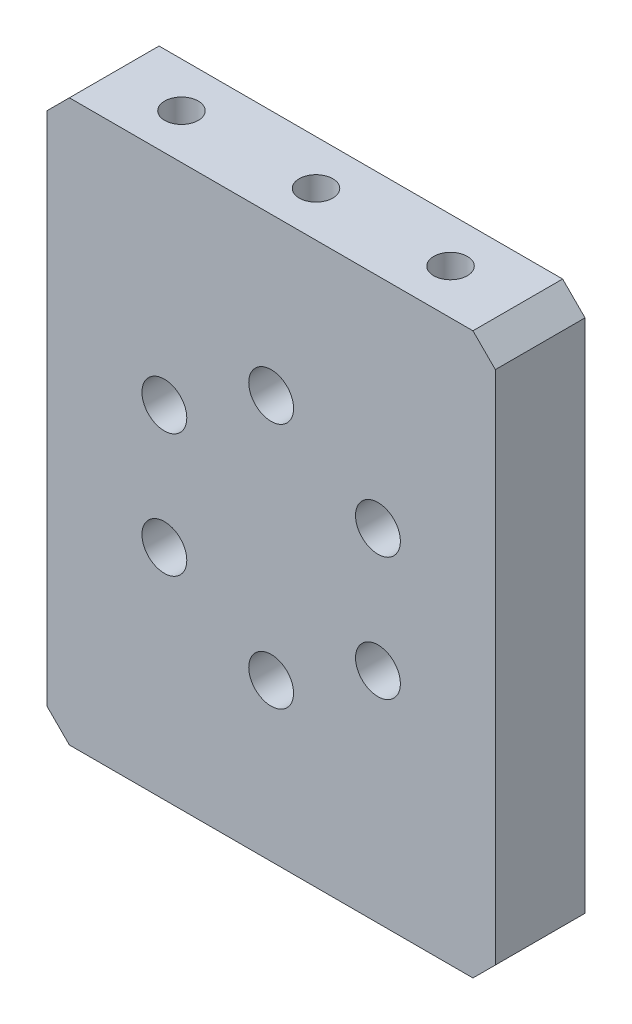
ISO-10303-21;
HEADER;
FILE_DESCRIPTION(('STEP AP214'),'2;1');
FILE_NAME('part.step','',(''),(''),'','','');
FILE_SCHEMA(('AUTOMOTIVE_DESIGN { 1 0 10303 214 1 1 1 1 }'));
ENDSEC;
DATA;
#1=APPLICATION_CONTEXT('core data for automotive mechanical design processes');
#2=APPLICATION_PROTOCOL_DEFINITION('international standard','automotive_design',2000,#1);
#3=PRODUCT_CONTEXT('',#1,'mechanical');
#4=PRODUCT('Part','Part','',(#3));
#5=PRODUCT_RELATED_PRODUCT_CATEGORY('part','',(#4));
#6=PRODUCT_DEFINITION_FORMATION('','',#4);
#7=PRODUCT_DEFINITION_CONTEXT('part definition',#1,'design');
#8=PRODUCT_DEFINITION('design','',#6,#7);
#9=PRODUCT_DEFINITION_SHAPE('','',#8);
#10=(LENGTH_UNIT() NAMED_UNIT(*) SI_UNIT(.MILLI.,.METRE.));
#11=(NAMED_UNIT(*) PLANE_ANGLE_UNIT() SI_UNIT($,.RADIAN.));
#12=(NAMED_UNIT(*) SI_UNIT($,.STERADIAN.) SOLID_ANGLE_UNIT());
#13=UNCERTAINTY_MEASURE_WITH_UNIT(LENGTH_MEASURE(1.E-05),#10,'distance_accuracy_value','');
#14=(GEOMETRIC_REPRESENTATION_CONTEXT(3) GLOBAL_UNCERTAINTY_ASSIGNED_CONTEXT((#13)) GLOBAL_UNIT_ASSIGNED_CONTEXT((#10,
#11,#12)) REPRESENTATION_CONTEXT('',''));
#15=CARTESIAN_POINT('',(0.,0.,0.));
#16=DIRECTION('',(0.,0.,1.));
#17=DIRECTION('',(1.,0.,0.));
#18=AXIS2_PLACEMENT_3D('',#15,#16,#17);
#19=CARTESIAN_POINT('',(20.,25.,8.));
#20=DIRECTION('',(-1.,0.,0.));
#21=DIRECTION('',(0.,-1.,0.));
#22=AXIS2_PLACEMENT_3D('',#19,#20,#21);
#23=PLANE('',#22);
#24=DIRECTION('',(0.,1.,0.));
#25=VECTOR('',#24,1.);
#26=CARTESIAN_POINT('',(20.,25.,8.));
#27=LINE('',#26,#25);
#28=CARTESIAN_POINT('',(20.,-23.,8.));
#29=VERTEX_POINT('',#28);
#30=CARTESIAN_POINT('',(20.,23.,8.));
#31=VERTEX_POINT('',#30);
#32=EDGE_CURVE('E135',#29,#31,#27,.T.);
#33=ORIENTED_EDGE('',*,*,#32,.F.);
#34=DIRECTION('',(0.,0.,-1.));
#35=VECTOR('',#34,1.);
#36=CARTESIAN_POINT('',(20.,-23.,8.));
#37=LINE('',#36,#35);
#38=CARTESIAN_POINT('',(20.,-23.,0.));
#39=VERTEX_POINT('',#38);
#40=EDGE_CURVE('E161',#29,#39,#37,.T.);
#41=ORIENTED_EDGE('',*,*,#40,.T.);
#42=DIRECTION('',(0.,1.,0.));
#43=VECTOR('',#42,1.);
#44=CARTESIAN_POINT('',(20.,25.,0.));
#45=LINE('',#44,#43);
#46=CARTESIAN_POINT('',(20.,23.,0.));
#47=VERTEX_POINT('',#46);
#48=EDGE_CURVE('E232',#39,#47,#45,.T.);
#49=ORIENTED_EDGE('',*,*,#48,.T.);
#50=DIRECTION('',(0.,0.,1.));
#51=VECTOR('',#50,1.);
#52=CARTESIAN_POINT('',(20.,23.,8.));
#53=LINE('',#52,#51);
#54=EDGE_CURVE('E159',#47,#31,#53,.T.);
#55=ORIENTED_EDGE('',*,*,#54,.T.);
#56=EDGE_LOOP('',(#33,#41,#49,#55));
#57=FACE_BOUND('',#56,.T.);
#58=ADVANCED_FACE('F41',(#57),#23,.F.);
#59=CARTESIAN_POINT('',(-20.,25.,8.));
#60=DIRECTION('',(0.,-1.,0.));
#61=DIRECTION('',(0.,0.,-1.));
#62=AXIS2_PLACEMENT_3D('',#59,#60,#61);
#63=PLANE('',#62);
#64=CARTESIAN_POINT('',(-12.,25.,4.));
#65=DIRECTION('',(0.,1.,0.));
#66=DIRECTION('',(0.,0.,1.));
#67=AXIS2_PLACEMENT_3D('',#64,#65,#66);
#68=CIRCLE('',#67,1.5);
#69=CARTESIAN_POINT('',(-12.,25.,5.5));
#70=VERTEX_POINT('',#69);
#71=EDGE_CURVE('E293',#70,#70,#68,.T.);
#72=ORIENTED_EDGE('',*,*,#71,.F.);
#73=EDGE_LOOP('',(#72));
#74=FACE_BOUND('',#73,.T.);
#75=CARTESIAN_POINT('',(0.,25.,4.));
#76=DIRECTION('',(0.,1.,0.));
#77=DIRECTION('',(0.,0.,1.));
#78=AXIS2_PLACEMENT_3D('',#75,#76,#77);
#79=CIRCLE('',#78,1.5);
#80=CARTESIAN_POINT('',(0.,25.,5.5));
#81=VERTEX_POINT('',#80);
#82=EDGE_CURVE('E290',#81,#81,#79,.T.);
#83=ORIENTED_EDGE('',*,*,#82,.F.);
#84=EDGE_LOOP('',(#83));
#85=FACE_BOUND('',#84,.T.);
#86=CARTESIAN_POINT('',(12.,25.,4.));
#87=DIRECTION('',(0.,1.,0.));
#88=DIRECTION('',(0.,0.,1.));
#89=AXIS2_PLACEMENT_3D('',#86,#87,#88);
#90=CIRCLE('',#89,1.5);
#91=CARTESIAN_POINT('',(12.,25.,5.5));
#92=VERTEX_POINT('',#91);
#93=EDGE_CURVE('E283',#92,#92,#90,.T.);
#94=ORIENTED_EDGE('',*,*,#93,.F.);
#95=EDGE_LOOP('',(#94));
#96=FACE_BOUND('',#95,.T.);
#97=DIRECTION('',(-1.,0.,0.));
#98=VECTOR('',#97,1.);
#99=CARTESIAN_POINT('',(-20.,25.,0.));
#100=LINE('',#99,#98);
#101=CARTESIAN_POINT('',(18.,25.,0.));
#102=VERTEX_POINT('',#101);
#103=CARTESIAN_POINT('',(-18.,25.,0.));
#104=VERTEX_POINT('',#103);
#105=EDGE_CURVE('E140',#102,#104,#100,.T.);
#106=ORIENTED_EDGE('',*,*,#105,.T.);
#107=DIRECTION('',(0.,0.,1.));
#108=VECTOR('',#107,1.);
#109=CARTESIAN_POINT('',(-18.,25.,8.));
#110=LINE('',#109,#108);
#111=CARTESIAN_POINT('',(-18.,25.,8.));
#112=VERTEX_POINT('',#111);
#113=EDGE_CURVE('E57',#104,#112,#110,.T.);
#114=ORIENTED_EDGE('',*,*,#113,.T.);
#115=DIRECTION('',(-1.,0.,0.));
#116=VECTOR('',#115,1.);
#117=CARTESIAN_POINT('',(-20.,25.,8.));
#118=LINE('',#117,#116);
#119=CARTESIAN_POINT('',(18.,25.,8.));
#120=VERTEX_POINT('',#119);
#121=EDGE_CURVE('E138',#120,#112,#118,.T.);
#122=ORIENTED_EDGE('',*,*,#121,.F.);
#123=DIRECTION('',(0.,0.,-1.));
#124=VECTOR('',#123,1.);
#125=CARTESIAN_POINT('',(18.,25.,8.));
#126=LINE('',#125,#124);
#127=EDGE_CURVE('E164',#120,#102,#126,.T.);
#128=ORIENTED_EDGE('',*,*,#127,.T.);
#129=EDGE_LOOP('',(#106,#114,#122,#128));
#130=FACE_BOUND('',#129,.T.);
#131=ADVANCED_FACE('F184',(#74,#85,#96,#130),#63,.F.);
#132=CARTESIAN_POINT('',(-20.,25.,8.));
#133=DIRECTION('',(1.,0.,0.));
#134=DIRECTION('',(0.,1.,0.));
#135=AXIS2_PLACEMENT_3D('',#132,#133,#134);
#136=PLANE('',#135);
#137=DIRECTION('',(0.,-1.,0.));
#138=VECTOR('',#137,1.);
#139=CARTESIAN_POINT('',(-20.,25.,0.));
#140=LINE('',#139,#138);
#141=CARTESIAN_POINT('',(-20.,23.,0.));
#142=VERTEX_POINT('',#141);
#143=CARTESIAN_POINT('',(-20.,-23.,0.));
#144=VERTEX_POINT('',#143);
#145=EDGE_CURVE('E136',#142,#144,#140,.T.);
#146=ORIENTED_EDGE('',*,*,#145,.T.);
#147=DIRECTION('',(0.,0.,1.));
#148=VECTOR('',#147,1.);
#149=CARTESIAN_POINT('',(-20.,-23.,8.));
#150=LINE('',#149,#148);
#151=CARTESIAN_POINT('',(-20.,-23.,8.));
#152=VERTEX_POINT('',#151);
#153=EDGE_CURVE('E114',#144,#152,#150,.T.);
#154=ORIENTED_EDGE('',*,*,#153,.T.);
#155=DIRECTION('',(0.,-1.,0.));
#156=VECTOR('',#155,1.);
#157=CARTESIAN_POINT('',(-20.,25.,8.));
#158=LINE('',#157,#156);
#159=CARTESIAN_POINT('',(-20.,23.,8.));
#160=VERTEX_POINT('',#159);
#161=EDGE_CURVE('E237',#160,#152,#158,.T.);
#162=ORIENTED_EDGE('',*,*,#161,.F.);
#163=DIRECTION('',(0.,0.,-1.));
#164=VECTOR('',#163,1.);
#165=CARTESIAN_POINT('',(-20.,23.,8.));
#166=LINE('',#165,#164);
#167=EDGE_CURVE('E119',#160,#142,#166,.T.);
#168=ORIENTED_EDGE('',*,*,#167,.T.);
#169=EDGE_LOOP('',(#146,#154,#162,#168));
#170=FACE_BOUND('',#169,.T.);
#171=ADVANCED_FACE('F190',(#170),#136,.F.);
#172=CARTESIAN_POINT('',(-20.,-25.,8.));
#173=DIRECTION('',(0.,1.,0.));
#174=DIRECTION('',(0.,0.,1.));
#175=AXIS2_PLACEMENT_3D('',#172,#173,#174);
#176=PLANE('',#175);
#177=CARTESIAN_POINT('',(-12.,-25.,4.));
#178=DIRECTION('',(0.,-1.,0.));
#179=DIRECTION('',(0.,0.,-1.));
#180=AXIS2_PLACEMENT_3D('',#177,#178,#179);
#181=CIRCLE('',#180,1.5);
#182=CARTESIAN_POINT('',(-12.,-25.,2.5));
#183=VERTEX_POINT('',#182);
#184=EDGE_CURVE('E310',#183,#183,#181,.T.);
#185=ORIENTED_EDGE('',*,*,#184,.F.);
#186=EDGE_LOOP('',(#185));
#187=FACE_BOUND('',#186,.T.);
#188=CARTESIAN_POINT('',(0.,-25.,4.));
#189=DIRECTION('',(0.,-1.,0.));
#190=DIRECTION('',(0.,0.,-1.));
#191=AXIS2_PLACEMENT_3D('',#188,#189,#190);
#192=CIRCLE('',#191,1.5);
#193=CARTESIAN_POINT('',(0.,-25.,2.5));
#194=VERTEX_POINT('',#193);
#195=EDGE_CURVE('E307',#194,#194,#192,.T.);
#196=ORIENTED_EDGE('',*,*,#195,.F.);
#197=EDGE_LOOP('',(#196));
#198=FACE_BOUND('',#197,.T.);
#199=CARTESIAN_POINT('',(12.,-25.,4.));
#200=DIRECTION('',(0.,-1.,0.));
#201=DIRECTION('',(0.,0.,-1.));
#202=AXIS2_PLACEMENT_3D('',#199,#200,#201);
#203=CIRCLE('',#202,1.5);
#204=CARTESIAN_POINT('',(12.,-25.,2.5));
#205=VERTEX_POINT('',#204);
#206=EDGE_CURVE('E301',#205,#205,#203,.T.);
#207=ORIENTED_EDGE('',*,*,#206,.F.);
#208=EDGE_LOOP('',(#207));
#209=FACE_BOUND('',#208,.T.);
#210=DIRECTION('',(1.,0.,0.));
#211=VECTOR('',#210,1.);
#212=CARTESIAN_POINT('',(-20.,-25.,8.));
#213=LINE('',#212,#211);
#214=CARTESIAN_POINT('',(-18.,-25.,8.));
#215=VERTEX_POINT('',#214);
#216=CARTESIAN_POINT('',(18.,-25.,8.));
#217=VERTEX_POINT('',#216);
#218=EDGE_CURVE('E129',#215,#217,#213,.T.);
#219=ORIENTED_EDGE('',*,*,#218,.F.);
#220=DIRECTION('',(0.,0.,-1.));
#221=VECTOR('',#220,1.);
#222=CARTESIAN_POINT('',(-18.,-25.,8.));
#223=LINE('',#222,#221);
#224=CARTESIAN_POINT('',(-18.,-25.,0.));
#225=VERTEX_POINT('',#224);
#226=EDGE_CURVE('E113',#215,#225,#223,.T.);
#227=ORIENTED_EDGE('',*,*,#226,.T.);
#228=DIRECTION('',(1.,0.,0.));
#229=VECTOR('',#228,1.);
#230=CARTESIAN_POINT('',(-20.,-25.,0.));
#231=LINE('',#230,#229);
#232=CARTESIAN_POINT('',(18.,-25.,0.));
#233=VERTEX_POINT('',#232);
#234=EDGE_CURVE('E126',#225,#233,#231,.T.);
#235=ORIENTED_EDGE('',*,*,#234,.T.);
#236=DIRECTION('',(0.,0.,1.));
#237=VECTOR('',#236,1.);
#238=CARTESIAN_POINT('',(18.,-25.,8.));
#239=LINE('',#238,#237);
#240=EDGE_CURVE('E131',#233,#217,#239,.T.);
#241=ORIENTED_EDGE('',*,*,#240,.T.);
#242=EDGE_LOOP('',(#219,#227,#235,#241));
#243=FACE_BOUND('',#242,.T.);
#244=ADVANCED_FACE('F125',(#187,#198,#209,#243),#176,.F.);
#245=CARTESIAN_POINT('',(0.,0.,8.));
#246=DIRECTION('',(0.,0.,1.));
#247=DIRECTION('',(1.,0.,0.));
#248=AXIS2_PLACEMENT_3D('',#245,#246,#247);
#249=PLANE('',#248);
#250=CARTESIAN_POINT('',(0.,11.,8.));
#251=DIRECTION('',(0.,0.,1.));
#252=DIRECTION('',(1.,0.,0.));
#253=AXIS2_PLACEMENT_3D('',#250,#251,#252);
#254=CIRCLE('',#253,2.);
#255=CARTESIAN_POINT('',(2.,11.,8.));
#256=VERTEX_POINT('',#255);
#257=EDGE_CURVE('E243',#256,#256,#254,.T.);
#258=ORIENTED_EDGE('',*,*,#257,.F.);
#259=EDGE_LOOP('',(#258));
#260=FACE_BOUND('',#259,.T.);
#261=CARTESIAN_POINT('',(9.52627944162866,5.4999999999997,8.));
#262=DIRECTION('',(0.,0.,1.));
#263=DIRECTION('',(1.,0.,0.));
#264=AXIS2_PLACEMENT_3D('',#261,#262,#263);
#265=CIRCLE('',#264,2.);
#266=CARTESIAN_POINT('',(11.5262794416287,5.4999999999997,8.));
#267=VERTEX_POINT('',#266);
#268=EDGE_CURVE('E246',#267,#267,#265,.T.);
#269=ORIENTED_EDGE('',*,*,#268,.F.);
#270=EDGE_LOOP('',(#269));
#271=FACE_BOUND('',#270,.T.);
#272=CARTESIAN_POINT('',(9.52627944162831,-5.5000000000003,8.));
#273=DIRECTION('',(0.,0.,1.));
#274=DIRECTION('',(1.,0.,0.));
#275=AXIS2_PLACEMENT_3D('',#272,#273,#274);
#276=CIRCLE('',#275,2.);
#277=CARTESIAN_POINT('',(11.5262794416283,-5.5000000000003,8.));
#278=VERTEX_POINT('',#277);
#279=EDGE_CURVE('E249',#278,#278,#276,.T.);
#280=ORIENTED_EDGE('',*,*,#279,.F.);
#281=EDGE_LOOP('',(#280));
#282=FACE_BOUND('',#281,.T.);
#283=CARTESIAN_POINT('',(-6.79549268051487E-13,-11.,8.));
#284=DIRECTION('',(0.,0.,1.));
#285=DIRECTION('',(1.,0.,0.));
#286=AXIS2_PLACEMENT_3D('',#283,#284,#285);
#287=CIRCLE('',#286,2.);
#288=CARTESIAN_POINT('',(1.99999999999932,-11.,8.));
#289=VERTEX_POINT('',#288);
#290=EDGE_CURVE('E252',#289,#289,#287,.T.);
#291=ORIENTED_EDGE('',*,*,#290,.F.);
#292=EDGE_LOOP('',(#291));
#293=FACE_BOUND('',#292,.T.);
#294=CARTESIAN_POINT('',(-9.52627944162934,-5.4999999999997,8.));
#295=DIRECTION('',(0.,0.,1.));
#296=DIRECTION('',(1.,0.,0.));
#297=AXIS2_PLACEMENT_3D('',#294,#295,#296);
#298=CIRCLE('',#297,2.);
#299=CARTESIAN_POINT('',(-7.52627944162934,-5.4999999999997,8.));
#300=VERTEX_POINT('',#299);
#301=EDGE_CURVE('E255',#300,#300,#298,.T.);
#302=ORIENTED_EDGE('',*,*,#301,.F.);
#303=EDGE_LOOP('',(#302));
#304=FACE_BOUND('',#303,.T.);
#305=CARTESIAN_POINT('',(-9.52627944162899,5.5000000000003,8.));
#306=DIRECTION('',(0.,0.,1.));
#307=DIRECTION('',(1.,0.,0.));
#308=AXIS2_PLACEMENT_3D('',#305,#306,#307);
#309=CIRCLE('',#308,2.);
#310=CARTESIAN_POINT('',(-7.52627944162899,5.5000000000003,8.));
#311=VERTEX_POINT('',#310);
#312=EDGE_CURVE('E258',#311,#311,#309,.T.);
#313=ORIENTED_EDGE('',*,*,#312,.F.);
#314=EDGE_LOOP('',(#313));
#315=FACE_BOUND('',#314,.T.);
#316=ORIENTED_EDGE('',*,*,#161,.T.);
#317=DIRECTION('',(-0.707106781186546,0.707106781186549,0.));
#318=VECTOR('',#317,1.);
#319=CARTESIAN_POINT('',(-21.5,-21.4999999999999,8.));
#320=LINE('',#319,#318);
#321=EDGE_CURVE('E157',#152,#215,#320,.F.);
#322=ORIENTED_EDGE('',*,*,#321,.T.);
#323=ORIENTED_EDGE('',*,*,#218,.T.);
#324=DIRECTION('',(-0.70710678118655,-0.707106781186545,0.));
#325=VECTOR('',#324,1.);
#326=CARTESIAN_POINT('',(21.4999999999999,-21.5000000000001,8.));
#327=LINE('',#326,#325);
#328=EDGE_CURVE('E155',#217,#29,#327,.F.);
#329=ORIENTED_EDGE('',*,*,#328,.T.);
#330=ORIENTED_EDGE('',*,*,#32,.T.);
#331=DIRECTION('',(0.707106781186546,-0.707106781186549,0.));
#332=VECTOR('',#331,1.);
#333=CARTESIAN_POINT('',(21.5,21.5,8.));
#334=LINE('',#333,#332);
#335=EDGE_CURVE('E64',#31,#120,#334,.F.);
#336=ORIENTED_EDGE('',*,*,#335,.T.);
#337=ORIENTED_EDGE('',*,*,#121,.T.);
#338=DIRECTION('',(0.707106781186549,0.707106781186546,0.));
#339=VECTOR('',#338,1.);
#340=CARTESIAN_POINT('',(-21.5,21.5,8.));
#341=LINE('',#340,#339);
#342=EDGE_CURVE('E153',#112,#160,#341,.F.);
#343=ORIENTED_EDGE('',*,*,#342,.T.);
#344=EDGE_LOOP('',(#316,#322,#323,#329,#330,#336,#337,#343));
#345=FACE_BOUND('',#344,.T.);
#346=ADVANCED_FACE('F324',(#260,#271,#282,#293,#304,#315,#345),#249,.T.);
#347=CARTESIAN_POINT('',(0.,0.,0.));
#348=DIRECTION('',(0.,0.,1.));
#349=DIRECTION('',(1.,0.,0.));
#350=AXIS2_PLACEMENT_3D('',#347,#348,#349);
#351=PLANE('',#350);
#352=CARTESIAN_POINT('',(0.,0.,0.));
#353=DIRECTION('',(0.,0.,1.));
#354=DIRECTION('',(1.,0.,0.));
#355=AXIS2_PLACEMENT_3D('',#352,#353,#354);
#356=CIRCLE('',#355,15.5);
#357=CARTESIAN_POINT('',(15.5,0.,0.));
#358=VERTEX_POINT('',#357);
#359=EDGE_CURVE('E11',#358,#358,#356,.T.);
#360=ORIENTED_EDGE('',*,*,#359,.T.);
#361=EDGE_LOOP('',(#360));
#362=FACE_BOUND('',#361,.T.);
#363=ORIENTED_EDGE('',*,*,#234,.F.);
#364=DIRECTION('',(0.707106781186546,-0.707106781186549,0.));
#365=VECTOR('',#364,1.);
#366=CARTESIAN_POINT('',(-18.,-25.,0.));
#367=LINE('',#366,#365);
#368=EDGE_CURVE('E109',#225,#144,#367,.F.);
#369=ORIENTED_EDGE('',*,*,#368,.T.);
#370=ORIENTED_EDGE('',*,*,#145,.F.);
#371=DIRECTION('',(-0.707106781186549,-0.707106781186546,0.));
#372=VECTOR('',#371,1.);
#373=CARTESIAN_POINT('',(-20.,23.,0.));
#374=LINE('',#373,#372);
#375=EDGE_CURVE('E146',#142,#104,#374,.F.);
#376=ORIENTED_EDGE('',*,*,#375,.T.);
#377=ORIENTED_EDGE('',*,*,#105,.F.);
#378=DIRECTION('',(-0.707106781186546,0.707106781186549,0.));
#379=VECTOR('',#378,1.);
#380=CARTESIAN_POINT('',(18.,25.,0.));
#381=LINE('',#380,#379);
#382=EDGE_CURVE('E130',#102,#47,#381,.F.);
#383=ORIENTED_EDGE('',*,*,#382,.T.);
#384=ORIENTED_EDGE('',*,*,#48,.F.);
#385=DIRECTION('',(0.70710678118655,0.707106781186545,0.));
#386=VECTOR('',#385,1.);
#387=CARTESIAN_POINT('',(20.,-23.,0.));
#388=LINE('',#387,#386);
#389=EDGE_CURVE('E120',#39,#233,#388,.F.);
#390=ORIENTED_EDGE('',*,*,#389,.T.);
#391=EDGE_LOOP('',(#363,#369,#370,#376,#377,#383,#384,#390));
#392=FACE_BOUND('',#391,.T.);
#393=ADVANCED_FACE('F133',(#362,#392),#351,.F.);
#394=CARTESIAN_POINT('',(0.,0.,4.));
#395=DIRECTION('',(0.,0.,-1.));
#396=DIRECTION('',(-1.,0.,0.));
#397=AXIS2_PLACEMENT_3D('',#394,#395,#396);
#398=CYLINDRICAL_SURFACE('',#397,15.);
#399=CARTESIAN_POINT('',(0.,0.,0.500000000000006));
#400=DIRECTION('',(0.,0.,1.));
#401=DIRECTION('',(1.,0.,0.));
#402=AXIS2_PLACEMENT_3D('',#399,#400,#401);
#403=CIRCLE('',#402,15.);
#404=CARTESIAN_POINT('',(15.,0.,0.500000000000006));
#405=VERTEX_POINT('',#404);
#406=EDGE_CURVE('E50',#405,#405,#403,.F.);
#407=ORIENTED_EDGE('',*,*,#406,.T.);
#408=EDGE_LOOP('',(#407));
#409=FACE_BOUND('',#408,.T.);
#410=CARTESIAN_POINT('',(0.,0.,4.));
#411=DIRECTION('',(0.,0.,-1.));
#412=DIRECTION('',(-1.,0.,0.));
#413=AXIS2_PLACEMENT_3D('',#410,#411,#412);
#414=CIRCLE('',#413,15.);
#415=CARTESIAN_POINT('',(-15.,0.,4.));
#416=VERTEX_POINT('',#415);
#417=EDGE_CURVE('E233',#416,#416,#414,.T.);
#418=ORIENTED_EDGE('',*,*,#417,.F.);
#419=EDGE_LOOP('',(#418));
#420=FACE_BOUND('',#419,.T.);
#421=ADVANCED_FACE('F170',(#409,#420),#398,.F.);
#422=CARTESIAN_POINT('',(0.,0.,4.));
#423=DIRECTION('',(0.,0.,-1.));
#424=DIRECTION('',(-1.,0.,0.));
#425=AXIS2_PLACEMENT_3D('',#422,#423,#424);
#426=PLANE('',#425);
#427=CARTESIAN_POINT('',(0.,11.,4.));
#428=DIRECTION('',(0.,0.,-1.));
#429=DIRECTION('',(-1.,0.,0.));
#430=AXIS2_PLACEMENT_3D('',#427,#428,#429);
#431=CIRCLE('',#430,2.);
#432=CARTESIAN_POINT('',(-2.,11.,4.));
#433=VERTEX_POINT('',#432);
#434=EDGE_CURVE('E261',#433,#433,#431,.T.);
#435=ORIENTED_EDGE('',*,*,#434,.F.);
#436=EDGE_LOOP('',(#435));
#437=FACE_BOUND('',#436,.T.);
#438=CARTESIAN_POINT('',(9.52627944162866,5.4999999999997,4.));
#439=DIRECTION('',(0.,0.,-1.));
#440=DIRECTION('',(-1.,0.,0.));
#441=AXIS2_PLACEMENT_3D('',#438,#439,#440);
#442=CIRCLE('',#441,2.);
#443=CARTESIAN_POINT('',(7.52627944162866,5.4999999999997,4.));
#444=VERTEX_POINT('',#443);
#445=EDGE_CURVE('E266',#444,#444,#442,.T.);
#446=ORIENTED_EDGE('',*,*,#445,.F.);
#447=EDGE_LOOP('',(#446));
#448=FACE_BOUND('',#447,.T.);
#449=CARTESIAN_POINT('',(9.52627944162831,-5.5000000000003,4.));
#450=DIRECTION('',(0.,0.,-1.));
#451=DIRECTION('',(-1.,0.,0.));
#452=AXIS2_PLACEMENT_3D('',#449,#450,#451);
#453=CIRCLE('',#452,2.);
#454=CARTESIAN_POINT('',(7.52627944162831,-5.5000000000003,4.));
#455=VERTEX_POINT('',#454);
#456=EDGE_CURVE('E262',#455,#455,#453,.T.);
#457=ORIENTED_EDGE('',*,*,#456,.F.);
#458=EDGE_LOOP('',(#457));
#459=FACE_BOUND('',#458,.T.);
#460=CARTESIAN_POINT('',(-6.79549268051487E-13,-11.,4.));
#461=DIRECTION('',(0.,0.,-1.));
#462=DIRECTION('',(-1.,0.,0.));
#463=AXIS2_PLACEMENT_3D('',#460,#461,#462);
#464=CIRCLE('',#463,2.);
#465=CARTESIAN_POINT('',(-2.00000000000068,-11.,4.));
#466=VERTEX_POINT('',#465);
#467=EDGE_CURVE('E265',#466,#466,#464,.T.);
#468=ORIENTED_EDGE('',*,*,#467,.F.);
#469=EDGE_LOOP('',(#468));
#470=FACE_BOUND('',#469,.T.);
#471=CARTESIAN_POINT('',(-9.52627944162934,-5.4999999999997,4.));
#472=DIRECTION('',(0.,0.,-1.));
#473=DIRECTION('',(-1.,0.,0.));
#474=AXIS2_PLACEMENT_3D('',#471,#472,#473);
#475=CIRCLE('',#474,2.);
#476=CARTESIAN_POINT('',(-11.5262794416293,-5.4999999999997,4.));
#477=VERTEX_POINT('',#476);
#478=EDGE_CURVE('E269',#477,#477,#475,.T.);
#479=ORIENTED_EDGE('',*,*,#478,.F.);
#480=EDGE_LOOP('',(#479));
#481=FACE_BOUND('',#480,.T.);
#482=CARTESIAN_POINT('',(-9.52627944162899,5.5000000000003,4.));
#483=DIRECTION('',(0.,0.,-1.));
#484=DIRECTION('',(-1.,0.,0.));
#485=AXIS2_PLACEMENT_3D('',#482,#483,#484);
#486=CIRCLE('',#485,2.);
#487=CARTESIAN_POINT('',(-11.526279441629,5.5000000000003,4.));
#488=VERTEX_POINT('',#487);
#489=EDGE_CURVE('E272',#488,#488,#486,.T.);
#490=ORIENTED_EDGE('',*,*,#489,.F.);
#491=EDGE_LOOP('',(#490));
#492=FACE_BOUND('',#491,.T.);
#493=ORIENTED_EDGE('',*,*,#417,.T.);
#494=EDGE_LOOP('',(#493));
#495=FACE_BOUND('',#494,.T.);
#496=ADVANCED_FACE('F376',(#437,#448,#459,#470,#481,#492,#495),#426,.T.);
#497=CARTESIAN_POINT('',(-9.52627944162899,5.5000000000003,14.));
#498=DIRECTION('',(0.,0.,-1.));
#499=DIRECTION('',(-1.,0.,0.));
#500=AXIS2_PLACEMENT_3D('',#497,#498,#499);
#501=CYLINDRICAL_SURFACE('',#500,2.);
#502=ORIENTED_EDGE('',*,*,#312,.T.);
#503=EDGE_LOOP('',(#502));
#504=FACE_BOUND('',#503,.T.);
#505=ORIENTED_EDGE('',*,*,#489,.T.);
#506=EDGE_LOOP('',(#505));
#507=FACE_BOUND('',#506,.T.);
#508=ADVANCED_FACE('F372',(#504,#507),#501,.F.);
#509=CARTESIAN_POINT('',(-9.52627944162934,-5.4999999999997,14.));
#510=DIRECTION('',(0.,0.,-1.));
#511=DIRECTION('',(-1.,0.,0.));
#512=AXIS2_PLACEMENT_3D('',#509,#510,#511);
#513=CYLINDRICAL_SURFACE('',#512,2.);
#514=ORIENTED_EDGE('',*,*,#301,.T.);
#515=EDGE_LOOP('',(#514));
#516=FACE_BOUND('',#515,.T.);
#517=ORIENTED_EDGE('',*,*,#478,.T.);
#518=EDGE_LOOP('',(#517));
#519=FACE_BOUND('',#518,.T.);
#520=ADVANCED_FACE('F375',(#516,#519),#513,.F.);
#521=CARTESIAN_POINT('',(-6.79549268051487E-13,-11.,14.));
#522=DIRECTION('',(0.,0.,-1.));
#523=DIRECTION('',(-1.,0.,0.));
#524=AXIS2_PLACEMENT_3D('',#521,#522,#523);
#525=CYLINDRICAL_SURFACE('',#524,2.);
#526=ORIENTED_EDGE('',*,*,#290,.T.);
#527=EDGE_LOOP('',(#526));
#528=FACE_BOUND('',#527,.T.);
#529=ORIENTED_EDGE('',*,*,#467,.T.);
#530=EDGE_LOOP('',(#529));
#531=FACE_BOUND('',#530,.T.);
#532=ADVANCED_FACE('F380',(#528,#531),#525,.F.);
#533=CARTESIAN_POINT('',(9.52627944162831,-5.5000000000003,14.));
#534=DIRECTION('',(0.,0.,-1.));
#535=DIRECTION('',(-1.,0.,0.));
#536=AXIS2_PLACEMENT_3D('',#533,#534,#535);
#537=CYLINDRICAL_SURFACE('',#536,2.);
#538=ORIENTED_EDGE('',*,*,#279,.T.);
#539=EDGE_LOOP('',(#538));
#540=FACE_BOUND('',#539,.T.);
#541=ORIENTED_EDGE('',*,*,#456,.T.);
#542=EDGE_LOOP('',(#541));
#543=FACE_BOUND('',#542,.T.);
#544=ADVANCED_FACE('F370',(#540,#543),#537,.F.);
#545=CARTESIAN_POINT('',(9.52627944162866,5.4999999999997,14.));
#546=DIRECTION('',(0.,0.,-1.));
#547=DIRECTION('',(-1.,0.,0.));
#548=AXIS2_PLACEMENT_3D('',#545,#546,#547);
#549=CYLINDRICAL_SURFACE('',#548,2.);
#550=ORIENTED_EDGE('',*,*,#268,.T.);
#551=EDGE_LOOP('',(#550));
#552=FACE_BOUND('',#551,.T.);
#553=ORIENTED_EDGE('',*,*,#445,.T.);
#554=EDGE_LOOP('',(#553));
#555=FACE_BOUND('',#554,.T.);
#556=ADVANCED_FACE('F366',(#552,#555),#549,.F.);
#557=CARTESIAN_POINT('',(0.,11.,14.));
#558=DIRECTION('',(0.,0.,-1.));
#559=DIRECTION('',(-1.,0.,0.));
#560=AXIS2_PLACEMENT_3D('',#557,#558,#559);
#561=CYLINDRICAL_SURFACE('',#560,2.);
#562=ORIENTED_EDGE('',*,*,#257,.T.);
#563=EDGE_LOOP('',(#562));
#564=FACE_BOUND('',#563,.T.);
#565=ORIENTED_EDGE('',*,*,#434,.T.);
#566=EDGE_LOOP('',(#565));
#567=FACE_BOUND('',#566,.T.);
#568=ADVANCED_FACE('F203',(#564,#567),#561,.F.);
#569=CARTESIAN_POINT('',(-18.,-25.,8.));
#570=DIRECTION('',(0.707106781186549,0.707106781186546,0.));
#571=DIRECTION('',(0.,0.,-1.));
#572=AXIS2_PLACEMENT_3D('',#569,#570,#571);
#573=PLANE('',#572);
#574=ORIENTED_EDGE('',*,*,#321,.F.);
#575=ORIENTED_EDGE('',*,*,#153,.F.);
#576=ORIENTED_EDGE('',*,*,#368,.F.);
#577=ORIENTED_EDGE('',*,*,#226,.F.);
#578=EDGE_LOOP('',(#574,#575,#576,#577));
#579=FACE_BOUND('',#578,.T.);
#580=ADVANCED_FACE('F112',(#579),#573,.F.);
#581=CARTESIAN_POINT('',(20.,-23.,8.));
#582=DIRECTION('',(-0.707106781186545,0.70710678118655,0.));
#583=DIRECTION('',(0.,0.,-1.));
#584=AXIS2_PLACEMENT_3D('',#581,#582,#583);
#585=PLANE('',#584);
#586=ORIENTED_EDGE('',*,*,#328,.F.);
#587=ORIENTED_EDGE('',*,*,#240,.F.);
#588=ORIENTED_EDGE('',*,*,#389,.F.);
#589=ORIENTED_EDGE('',*,*,#40,.F.);
#590=EDGE_LOOP('',(#586,#587,#588,#589));
#591=FACE_BOUND('',#590,.T.);
#592=ADVANCED_FACE('F202',(#591),#585,.F.);
#593=CARTESIAN_POINT('',(-20.,23.,8.));
#594=DIRECTION('',(0.707106781186546,-0.707106781186549,0.));
#595=DIRECTION('',(0.,0.,-1.));
#596=AXIS2_PLACEMENT_3D('',#593,#594,#595);
#597=PLANE('',#596);
#598=ORIENTED_EDGE('',*,*,#342,.F.);
#599=ORIENTED_EDGE('',*,*,#113,.F.);
#600=ORIENTED_EDGE('',*,*,#375,.F.);
#601=ORIENTED_EDGE('',*,*,#167,.F.);
#602=EDGE_LOOP('',(#598,#599,#600,#601));
#603=FACE_BOUND('',#602,.T.);
#604=ADVANCED_FACE('F209',(#603),#597,.F.);
#605=CARTESIAN_POINT('',(18.,25.,8.));
#606=DIRECTION('',(-0.707106781186549,-0.707106781186546,0.));
#607=DIRECTION('',(0.,0.,-1.));
#608=AXIS2_PLACEMENT_3D('',#605,#606,#607);
#609=PLANE('',#608);
#610=ORIENTED_EDGE('',*,*,#335,.F.);
#611=ORIENTED_EDGE('',*,*,#54,.F.);
#612=ORIENTED_EDGE('',*,*,#382,.F.);
#613=ORIENTED_EDGE('',*,*,#127,.F.);
#614=EDGE_LOOP('',(#610,#611,#612,#613));
#615=FACE_BOUND('',#614,.T.);
#616=ADVANCED_FACE('F215',(#615),#609,.F.);
#617=CARTESIAN_POINT('',(12.,19.,4.));
#618=DIRECTION('',(0.,1.,0.));
#619=DIRECTION('',(0.,0.,1.));
#620=AXIS2_PLACEMENT_3D('',#617,#618,#619);
#621=CYLINDRICAL_SURFACE('',#620,1.5);
#622=CARTESIAN_POINT('',(12.,19.,4.));
#623=DIRECTION('',(0.,1.,0.));
#624=DIRECTION('',(0.,0.,1.));
#625=AXIS2_PLACEMENT_3D('',#622,#623,#624);
#626=CIRCLE('',#625,1.5);
#627=CARTESIAN_POINT('',(12.,19.,5.5));
#628=VERTEX_POINT('',#627);
#629=EDGE_CURVE('E280',#628,#628,#626,.T.);
#630=ORIENTED_EDGE('',*,*,#629,.F.);
#631=EDGE_LOOP('',(#630));
#632=FACE_BOUND('',#631,.T.);
#633=ORIENTED_EDGE('',*,*,#93,.T.);
#634=EDGE_LOOP('',(#633));
#635=FACE_BOUND('',#634,.T.);
#636=ADVANCED_FACE('F220',(#632,#635),#621,.F.);
#637=CARTESIAN_POINT('',(12.,19.,4.));
#638=DIRECTION('',(0.,1.,0.));
#639=DIRECTION('',(0.,0.,1.));
#640=AXIS2_PLACEMENT_3D('',#637,#638,#639);
#641=PLANE('',#640);
#642=ORIENTED_EDGE('',*,*,#629,.T.);
#643=EDGE_LOOP('',(#642));
#644=FACE_BOUND('',#643,.T.);
#645=ADVANCED_FACE('F225',(#644),#641,.T.);
#646=CARTESIAN_POINT('',(0.,19.,4.));
#647=DIRECTION('',(0.,1.,0.));
#648=DIRECTION('',(0.,0.,1.));
#649=AXIS2_PLACEMENT_3D('',#646,#647,#648);
#650=CYLINDRICAL_SURFACE('',#649,1.5);
#651=CARTESIAN_POINT('',(0.,19.,4.));
#652=DIRECTION('',(0.,1.,0.));
#653=DIRECTION('',(0.,0.,1.));
#654=AXIS2_PLACEMENT_3D('',#651,#652,#653);
#655=CIRCLE('',#654,1.5);
#656=CARTESIAN_POINT('',(0.,19.,5.5));
#657=VERTEX_POINT('',#656);
#658=EDGE_CURVE('E287',#657,#657,#655,.T.);
#659=ORIENTED_EDGE('',*,*,#658,.F.);
#660=EDGE_LOOP('',(#659));
#661=FACE_BOUND('',#660,.T.);
#662=ORIENTED_EDGE('',*,*,#82,.T.);
#663=EDGE_LOOP('',(#662));
#664=FACE_BOUND('',#663,.T.);
#665=ADVANCED_FACE('F354',(#661,#664),#650,.F.);
#666=CARTESIAN_POINT('',(0.,19.,4.));
#667=DIRECTION('',(0.,1.,0.));
#668=DIRECTION('',(0.,0.,1.));
#669=AXIS2_PLACEMENT_3D('',#666,#667,#668);
#670=PLANE('',#669);
#671=ORIENTED_EDGE('',*,*,#658,.T.);
#672=EDGE_LOOP('',(#671));
#673=FACE_BOUND('',#672,.T.);
#674=ADVANCED_FACE('F352',(#673),#670,.T.);
#675=CARTESIAN_POINT('',(-12.,19.,4.));
#676=DIRECTION('',(0.,1.,0.));
#677=DIRECTION('',(0.,0.,1.));
#678=AXIS2_PLACEMENT_3D('',#675,#676,#677);
#679=CYLINDRICAL_SURFACE('',#678,1.5);
#680=CARTESIAN_POINT('',(-12.,19.,4.));
#681=DIRECTION('',(0.,1.,0.));
#682=DIRECTION('',(0.,0.,1.));
#683=AXIS2_PLACEMENT_3D('',#680,#681,#682);
#684=CIRCLE('',#683,1.5);
#685=CARTESIAN_POINT('',(-12.,19.,5.5));
#686=VERTEX_POINT('',#685);
#687=EDGE_CURVE('E277',#686,#686,#684,.T.);
#688=ORIENTED_EDGE('',*,*,#687,.F.);
#689=EDGE_LOOP('',(#688));
#690=FACE_BOUND('',#689,.T.);
#691=ORIENTED_EDGE('',*,*,#71,.T.);
#692=EDGE_LOOP('',(#691));
#693=FACE_BOUND('',#692,.T.);
#694=ADVANCED_FACE('F343',(#690,#693),#679,.F.);
#695=CARTESIAN_POINT('',(-12.,19.,4.));
#696=DIRECTION('',(0.,1.,0.));
#697=DIRECTION('',(0.,0.,1.));
#698=AXIS2_PLACEMENT_3D('',#695,#696,#697);
#699=PLANE('',#698);
#700=ORIENTED_EDGE('',*,*,#687,.T.);
#701=EDGE_LOOP('',(#700));
#702=FACE_BOUND('',#701,.T.);
#703=ADVANCED_FACE('F333',(#702),#699,.T.);
#704=CARTESIAN_POINT('',(12.,-19.,4.));
#705=DIRECTION('',(0.,-1.,0.));
#706=DIRECTION('',(0.,0.,-1.));
#707=AXIS2_PLACEMENT_3D('',#704,#705,#706);
#708=CYLINDRICAL_SURFACE('',#707,1.5);
#709=CARTESIAN_POINT('',(12.,-19.,4.));
#710=DIRECTION('',(0.,-1.,0.));
#711=DIRECTION('',(0.,0.,-1.));
#712=AXIS2_PLACEMENT_3D('',#709,#710,#711);
#713=CIRCLE('',#712,1.5);
#714=CARTESIAN_POINT('',(12.,-19.,2.5));
#715=VERTEX_POINT('',#714);
#716=EDGE_CURVE('E298',#715,#715,#713,.T.);
#717=ORIENTED_EDGE('',*,*,#716,.F.);
#718=EDGE_LOOP('',(#717));
#719=FACE_BOUND('',#718,.T.);
#720=ORIENTED_EDGE('',*,*,#206,.T.);
#721=EDGE_LOOP('',(#720));
#722=FACE_BOUND('',#721,.T.);
#723=ADVANCED_FACE('F330',(#719,#722),#708,.F.);
#724=CARTESIAN_POINT('',(12.,-19.,4.));
#725=DIRECTION('',(0.,-1.,0.));
#726=DIRECTION('',(0.,0.,-1.));
#727=AXIS2_PLACEMENT_3D('',#724,#725,#726);
#728=PLANE('',#727);
#729=ORIENTED_EDGE('',*,*,#716,.T.);
#730=EDGE_LOOP('',(#729));
#731=FACE_BOUND('',#730,.T.);
#732=ADVANCED_FACE('F332',(#731),#728,.T.);
#733=CARTESIAN_POINT('',(0.,-19.,4.));
#734=DIRECTION('',(0.,-1.,0.));
#735=DIRECTION('',(0.,0.,-1.));
#736=AXIS2_PLACEMENT_3D('',#733,#734,#735);
#737=CYLINDRICAL_SURFACE('',#736,1.5);
#738=CARTESIAN_POINT('',(0.,-19.,4.));
#739=DIRECTION('',(0.,-1.,0.));
#740=DIRECTION('',(0.,0.,-1.));
#741=AXIS2_PLACEMENT_3D('',#738,#739,#740);
#742=CIRCLE('',#741,1.5);
#743=CARTESIAN_POINT('',(0.,-19.,2.5));
#744=VERTEX_POINT('',#743);
#745=EDGE_CURVE('E304',#744,#744,#742,.T.);
#746=ORIENTED_EDGE('',*,*,#745,.F.);
#747=EDGE_LOOP('',(#746));
#748=FACE_BOUND('',#747,.T.);
#749=ORIENTED_EDGE('',*,*,#195,.T.);
#750=EDGE_LOOP('',(#749));
#751=FACE_BOUND('',#750,.T.);
#752=ADVANCED_FACE('F340',(#748,#751),#737,.F.);
#753=CARTESIAN_POINT('',(0.,-19.,4.));
#754=DIRECTION('',(0.,-1.,0.));
#755=DIRECTION('',(0.,0.,-1.));
#756=AXIS2_PLACEMENT_3D('',#753,#754,#755);
#757=PLANE('',#756);
#758=ORIENTED_EDGE('',*,*,#745,.T.);
#759=EDGE_LOOP('',(#758));
#760=FACE_BOUND('',#759,.T.);
#761=ADVANCED_FACE('F318',(#760),#757,.T.);
#762=CARTESIAN_POINT('',(-12.,-19.,4.));
#763=DIRECTION('',(0.,-1.,0.));
#764=DIRECTION('',(0.,0.,-1.));
#765=AXIS2_PLACEMENT_3D('',#762,#763,#764);
#766=CYLINDRICAL_SURFACE('',#765,1.5);
#767=CARTESIAN_POINT('',(-12.,-19.,4.));
#768=DIRECTION('',(0.,-1.,0.));
#769=DIRECTION('',(0.,0.,-1.));
#770=AXIS2_PLACEMENT_3D('',#767,#768,#769);
#771=CIRCLE('',#770,1.5);
#772=CARTESIAN_POINT('',(-12.,-19.,2.5));
#773=VERTEX_POINT('',#772);
#774=EDGE_CURVE('E284',#773,#773,#771,.T.);
#775=ORIENTED_EDGE('',*,*,#774,.F.);
#776=EDGE_LOOP('',(#775));
#777=FACE_BOUND('',#776,.T.);
#778=ORIENTED_EDGE('',*,*,#184,.T.);
#779=EDGE_LOOP('',(#778));
#780=FACE_BOUND('',#779,.T.);
#781=ADVANCED_FACE('F179',(#777,#780),#766,.F.);
#782=CARTESIAN_POINT('',(-12.,-19.,4.));
#783=DIRECTION('',(0.,-1.,0.));
#784=DIRECTION('',(0.,0.,-1.));
#785=AXIS2_PLACEMENT_3D('',#782,#783,#784);
#786=PLANE('',#785);
#787=ORIENTED_EDGE('',*,*,#774,.T.);
#788=EDGE_LOOP('',(#787));
#789=FACE_BOUND('',#788,.T.);
#790=ADVANCED_FACE('F174',(#789),#786,.T.);
#791=CARTESIAN_POINT('',(0.,0.,0.500000000000006));
#792=DIRECTION('',(0.,0.,-1.));
#793=DIRECTION('',(-1.,0.,0.));
#794=AXIS2_PLACEMENT_3D('',#791,#792,#793);
#795=CONICAL_SURFACE('',#794,15.,0.785398163397445);
#796=ORIENTED_EDGE('',*,*,#359,.F.);
#797=EDGE_LOOP('',(#796));
#798=FACE_BOUND('',#797,.T.);
#799=ORIENTED_EDGE('',*,*,#406,.F.);
#800=EDGE_LOOP('',(#799));
#801=FACE_BOUND('',#800,.T.);
#802=ADVANCED_FACE('F44',(#798,#801),#795,.F.);
#803=CLOSED_SHELL('',(#58,#131,#171,#244,#346,#393,#421,#496,#508,#520,#532,#544,#556,#568,#580,
#592,#604,#616,#636,#645,#665,#674,#694,#703,#723,#732,#752,#761,#781,#790,#802));
#804=MANIFOLD_SOLID_BREP('B2',#803);
#805=ADVANCED_BREP_SHAPE_REPRESENTATION('',(#18,#804),#14);
#806=SHAPE_DEFINITION_REPRESENTATION(#9,#805);
ENDSEC;
END-ISO-10303-21;
